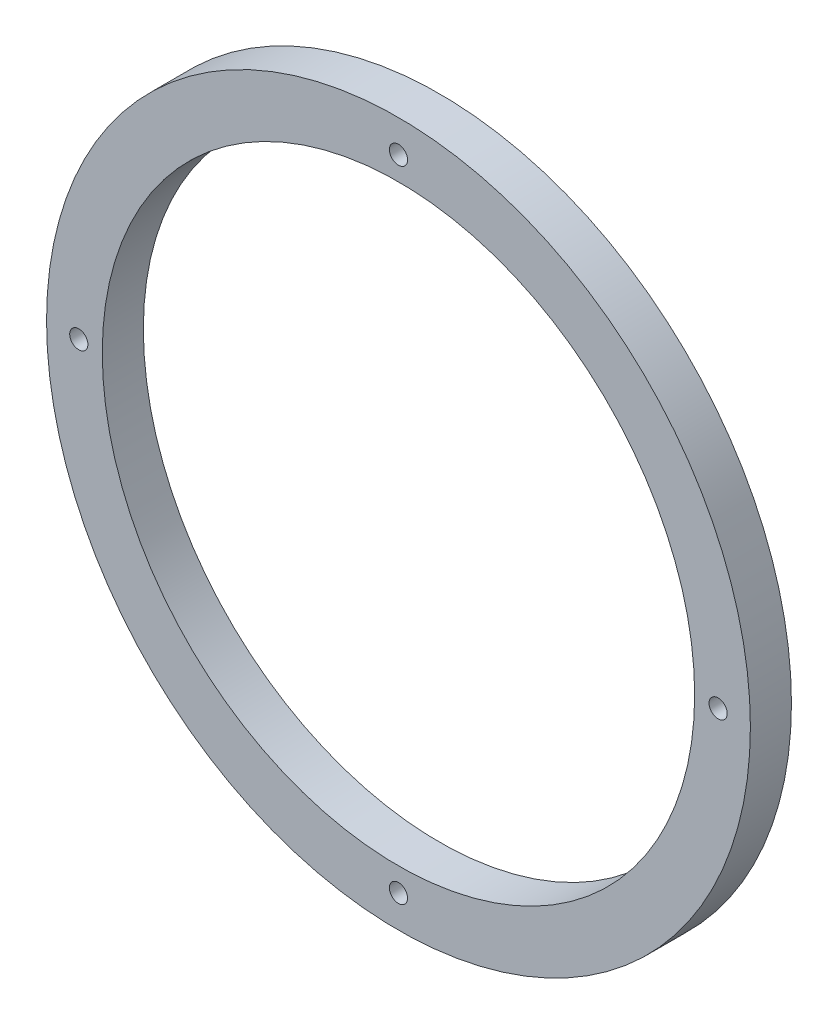
ISO-10303-21;
HEADER;
FILE_DESCRIPTION(('STEP AP214'),'2;1');
FILE_NAME('part.step','',(''),(''),'','','');
FILE_SCHEMA(('AUTOMOTIVE_DESIGN { 1 0 10303 214 1 1 1 1 }'));
ENDSEC;
DATA;
#1=APPLICATION_CONTEXT('core data for automotive mechanical design processes');
#2=APPLICATION_PROTOCOL_DEFINITION('international standard','automotive_design',2000,#1);
#3=PRODUCT_CONTEXT('',#1,'mechanical');
#4=PRODUCT('Part','Part','',(#3));
#5=PRODUCT_RELATED_PRODUCT_CATEGORY('part','',(#4));
#6=PRODUCT_DEFINITION_FORMATION('','',#4);
#7=PRODUCT_DEFINITION_CONTEXT('part definition',#1,'design');
#8=PRODUCT_DEFINITION('design','',#6,#7);
#9=PRODUCT_DEFINITION_SHAPE('','',#8);
#10=(LENGTH_UNIT() NAMED_UNIT(*) SI_UNIT(.MILLI.,.METRE.));
#11=(NAMED_UNIT(*) PLANE_ANGLE_UNIT() SI_UNIT($,.RADIAN.));
#12=(NAMED_UNIT(*) SI_UNIT($,.STERADIAN.) SOLID_ANGLE_UNIT());
#13=UNCERTAINTY_MEASURE_WITH_UNIT(LENGTH_MEASURE(1.E-05),#10,'distance_accuracy_value','');
#14=(GEOMETRIC_REPRESENTATION_CONTEXT(3) GLOBAL_UNCERTAINTY_ASSIGNED_CONTEXT((#13)) GLOBAL_UNIT_ASSIGNED_CONTEXT((#10,
#11,#12)) REPRESENTATION_CONTEXT('',''));
#15=CARTESIAN_POINT('',(0.,0.,0.));
#16=DIRECTION('',(0.,0.,1.));
#17=DIRECTION('',(1.,0.,0.));
#18=AXIS2_PLACEMENT_3D('',#15,#16,#17);
#19=CARTESIAN_POINT('',(0.,0.,7.));
#20=DIRECTION('',(0.,0.,1.));
#21=DIRECTION('',(1.,0.,0.));
#22=AXIS2_PLACEMENT_3D('',#19,#20,#21);
#23=PLANE('',#22);
#24=CARTESIAN_POINT('',(-5.70857198900852E-13,-54.5,7.));
#25=DIRECTION('',(0.,0.,1.));
#26=DIRECTION('',(1.,0.,0.));
#27=AXIS2_PLACEMENT_3D('',#24,#25,#26);
#28=CIRCLE('',#27,1.55);
#29=CARTESIAN_POINT('',(1.54999999999943,-54.5,7.));
#30=VERTEX_POINT('',#29);
#31=EDGE_CURVE('E70',#30,#30,#28,.T.);
#32=ORIENTED_EDGE('',*,*,#31,.F.);
#33=EDGE_LOOP('',(#32));
#34=FACE_BOUND('',#33,.T.);
#35=CARTESIAN_POINT('',(54.5,-3.80571465933902E-13,7.));
#36=DIRECTION('',(0.,0.,1.));
#37=DIRECTION('',(1.,0.,0.));
#38=AXIS2_PLACEMENT_3D('',#35,#36,#37);
#39=CIRCLE('',#38,1.55);
#40=CARTESIAN_POINT('',(56.05,-3.80571465933902E-13,7.));
#41=VERTEX_POINT('',#40);
#42=EDGE_CURVE('E64',#41,#41,#39,.T.);
#43=ORIENTED_EDGE('',*,*,#42,.F.);
#44=EDGE_LOOP('',(#43));
#45=FACE_BOUND('',#44,.T.);
#46=CARTESIAN_POINT('',(1.90285732966951E-13,54.5,7.));
#47=DIRECTION('',(0.,0.,1.));
#48=DIRECTION('',(1.,0.,0.));
#49=AXIS2_PLACEMENT_3D('',#46,#47,#48);
#50=CIRCLE('',#49,1.55);
#51=CARTESIAN_POINT('',(1.55000000000019,54.5,7.));
#52=VERTEX_POINT('',#51);
#53=EDGE_CURVE('E58',#52,#52,#50,.T.);
#54=ORIENTED_EDGE('',*,*,#53,.F.);
#55=EDGE_LOOP('',(#54));
#56=FACE_BOUND('',#55,.T.);
#57=CARTESIAN_POINT('',(-54.5,0.,7.));
#58=DIRECTION('',(0.,0.,1.));
#59=DIRECTION('',(1.,0.,0.));
#60=AXIS2_PLACEMENT_3D('',#57,#58,#59);
#61=CIRCLE('',#60,1.55);
#62=CARTESIAN_POINT('',(-52.95,0.,7.));
#63=VERTEX_POINT('',#62);
#64=EDGE_CURVE('E52',#63,#63,#61,.T.);
#65=ORIENTED_EDGE('',*,*,#64,.F.);
#66=EDGE_LOOP('',(#65));
#67=FACE_BOUND('',#66,.T.);
#68=CARTESIAN_POINT('',(0.,0.,7.));
#69=DIRECTION('',(0.,0.,1.));
#70=DIRECTION('',(1.,0.,0.));
#71=AXIS2_PLACEMENT_3D('',#68,#69,#70);
#72=CIRCLE('',#71,60.);
#73=CARTESIAN_POINT('',(60.,0.,7.));
#74=VERTEX_POINT('',#73);
#75=EDGE_CURVE('E10',#74,#74,#72,.T.);
#76=ORIENTED_EDGE('',*,*,#75,.T.);
#77=EDGE_LOOP('',(#76));
#78=FACE_BOUND('',#77,.T.);
#79=CARTESIAN_POINT('',(0.,0.,7.));
#80=DIRECTION('',(0.,0.,1.));
#81=DIRECTION('',(1.,0.,0.));
#82=AXIS2_PLACEMENT_3D('',#79,#80,#81);
#83=CIRCLE('',#82,50.5);
#84=CARTESIAN_POINT('',(50.5,0.,7.));
#85=VERTEX_POINT('',#84);
#86=EDGE_CURVE('E44',#85,#85,#83,.T.);
#87=ORIENTED_EDGE('',*,*,#86,.F.);
#88=EDGE_LOOP('',(#87));
#89=FACE_BOUND('',#88,.T.);
#90=ADVANCED_FACE('F33',(#34,#45,#56,#67,#78,#89),#23,.T.);
#91=CARTESIAN_POINT('',(0.,0.,0.));
#92=DIRECTION('',(0.,0.,1.));
#93=DIRECTION('',(1.,0.,0.));
#94=AXIS2_PLACEMENT_3D('',#91,#92,#93);
#95=PLANE('',#94);
#96=CARTESIAN_POINT('',(-5.70857198900852E-13,-54.5,0.));
#97=DIRECTION('',(0.,0.,1.));
#98=DIRECTION('',(1.,0.,0.));
#99=AXIS2_PLACEMENT_3D('',#96,#97,#98);
#100=CIRCLE('',#99,1.55);
#101=CARTESIAN_POINT('',(1.54999999999943,-54.5,0.));
#102=VERTEX_POINT('',#101);
#103=EDGE_CURVE('E67',#102,#102,#100,.T.);
#104=ORIENTED_EDGE('',*,*,#103,.T.);
#105=EDGE_LOOP('',(#104));
#106=FACE_BOUND('',#105,.T.);
#107=CARTESIAN_POINT('',(54.5,-3.80571465933902E-13,0.));
#108=DIRECTION('',(0.,0.,1.));
#109=DIRECTION('',(1.,0.,0.));
#110=AXIS2_PLACEMENT_3D('',#107,#108,#109);
#111=CIRCLE('',#110,1.55);
#112=CARTESIAN_POINT('',(56.05,-3.80571465933902E-13,0.));
#113=VERTEX_POINT('',#112);
#114=EDGE_CURVE('E61',#113,#113,#111,.T.);
#115=ORIENTED_EDGE('',*,*,#114,.T.);
#116=EDGE_LOOP('',(#115));
#117=FACE_BOUND('',#116,.T.);
#118=CARTESIAN_POINT('',(1.90285732966951E-13,54.5,0.));
#119=DIRECTION('',(0.,0.,1.));
#120=DIRECTION('',(1.,0.,0.));
#121=AXIS2_PLACEMENT_3D('',#118,#119,#120);
#122=CIRCLE('',#121,1.55);
#123=CARTESIAN_POINT('',(1.55000000000019,54.5,0.));
#124=VERTEX_POINT('',#123);
#125=EDGE_CURVE('E55',#124,#124,#122,.T.);
#126=ORIENTED_EDGE('',*,*,#125,.T.);
#127=EDGE_LOOP('',(#126));
#128=FACE_BOUND('',#127,.T.);
#129=CARTESIAN_POINT('',(-54.5,0.,0.));
#130=DIRECTION('',(0.,0.,1.));
#131=DIRECTION('',(1.,0.,0.));
#132=AXIS2_PLACEMENT_3D('',#129,#130,#131);
#133=CIRCLE('',#132,1.55);
#134=CARTESIAN_POINT('',(-52.95,0.,0.));
#135=VERTEX_POINT('',#134);
#136=EDGE_CURVE('E49',#135,#135,#133,.T.);
#137=ORIENTED_EDGE('',*,*,#136,.T.);
#138=EDGE_LOOP('',(#137));
#139=FACE_BOUND('',#138,.T.);
#140=CARTESIAN_POINT('',(0.,0.,0.));
#141=DIRECTION('',(0.,0.,1.));
#142=DIRECTION('',(1.,0.,0.));
#143=AXIS2_PLACEMENT_3D('',#140,#141,#142);
#144=CIRCLE('',#143,60.);
#145=CARTESIAN_POINT('',(60.,0.,0.));
#146=VERTEX_POINT('',#145);
#147=EDGE_CURVE('E37',#146,#146,#144,.T.);
#148=ORIENTED_EDGE('',*,*,#147,.F.);
#149=EDGE_LOOP('',(#148));
#150=FACE_BOUND('',#149,.T.);
#151=CARTESIAN_POINT('',(0.,0.,0.));
#152=DIRECTION('',(0.,0.,1.));
#153=DIRECTION('',(1.,0.,0.));
#154=AXIS2_PLACEMENT_3D('',#151,#152,#153);
#155=CIRCLE('',#154,50.5);
#156=CARTESIAN_POINT('',(50.5,0.,0.));
#157=VERTEX_POINT('',#156);
#158=EDGE_CURVE('E46',#157,#157,#155,.T.);
#159=ORIENTED_EDGE('',*,*,#158,.T.);
#160=EDGE_LOOP('',(#159));
#161=FACE_BOUND('',#160,.T.);
#162=ADVANCED_FACE('F76',(#106,#117,#128,#139,#150,#161),#95,.F.);
#163=CARTESIAN_POINT('',(0.,0.,7.));
#164=DIRECTION('',(0.,0.,-1.));
#165=DIRECTION('',(-1.,0.,0.));
#166=AXIS2_PLACEMENT_3D('',#163,#164,#165);
#167=CYLINDRICAL_SURFACE('',#166,60.);
#168=ORIENTED_EDGE('',*,*,#75,.F.);
#169=EDGE_LOOP('',(#168));
#170=FACE_BOUND('',#169,.T.);
#171=ORIENTED_EDGE('',*,*,#147,.T.);
#172=EDGE_LOOP('',(#171));
#173=FACE_BOUND('',#172,.T.);
#174=ADVANCED_FACE('F35',(#170,#173),#167,.T.);
#175=CARTESIAN_POINT('',(0.,0.,7.));
#176=DIRECTION('',(0.,0.,-1.));
#177=DIRECTION('',(-1.,0.,0.));
#178=AXIS2_PLACEMENT_3D('',#175,#176,#177);
#179=CYLINDRICAL_SURFACE('',#178,50.5);
#180=ORIENTED_EDGE('',*,*,#86,.T.);
#181=EDGE_LOOP('',(#180));
#182=FACE_BOUND('',#181,.T.);
#183=ORIENTED_EDGE('',*,*,#158,.F.);
#184=EDGE_LOOP('',(#183));
#185=FACE_BOUND('',#184,.T.);
#186=ADVANCED_FACE('F97',(#182,#185),#179,.F.);
#187=CARTESIAN_POINT('',(-54.5,0.,0.));
#188=DIRECTION('',(0.,0.,1.));
#189=DIRECTION('',(1.,0.,0.));
#190=AXIS2_PLACEMENT_3D('',#187,#188,#189);
#191=CYLINDRICAL_SURFACE('',#190,1.55);
#192=ORIENTED_EDGE('',*,*,#136,.F.);
#193=EDGE_LOOP('',(#192));
#194=FACE_BOUND('',#193,.T.);
#195=ORIENTED_EDGE('',*,*,#64,.T.);
#196=EDGE_LOOP('',(#195));
#197=FACE_BOUND('',#196,.T.);
#198=ADVANCED_FACE('F100',(#194,#197),#191,.F.);
#199=CARTESIAN_POINT('',(1.90285732966951E-13,54.5,0.));
#200=DIRECTION('',(0.,0.,1.));
#201=DIRECTION('',(1.,0.,0.));
#202=AXIS2_PLACEMENT_3D('',#199,#200,#201);
#203=CYLINDRICAL_SURFACE('',#202,1.55);
#204=ORIENTED_EDGE('',*,*,#125,.F.);
#205=EDGE_LOOP('',(#204));
#206=FACE_BOUND('',#205,.T.);
#207=ORIENTED_EDGE('',*,*,#53,.T.);
#208=EDGE_LOOP('',(#207));
#209=FACE_BOUND('',#208,.T.);
#210=ADVANCED_FACE('F112',(#206,#209),#203,.F.);
#211=CARTESIAN_POINT('',(54.5,-3.80571465933902E-13,0.));
#212=DIRECTION('',(0.,0.,1.));
#213=DIRECTION('',(1.,0.,0.));
#214=AXIS2_PLACEMENT_3D('',#211,#212,#213);
#215=CYLINDRICAL_SURFACE('',#214,1.55);
#216=ORIENTED_EDGE('',*,*,#114,.F.);
#217=EDGE_LOOP('',(#216));
#218=FACE_BOUND('',#217,.T.);
#219=ORIENTED_EDGE('',*,*,#42,.T.);
#220=EDGE_LOOP('',(#219));
#221=FACE_BOUND('',#220,.T.);
#222=ADVANCED_FACE('F82',(#218,#221),#215,.F.);
#223=CARTESIAN_POINT('',(-5.70857198900852E-13,-54.5,0.));
#224=DIRECTION('',(0.,0.,1.));
#225=DIRECTION('',(1.,0.,0.));
#226=AXIS2_PLACEMENT_3D('',#223,#224,#225);
#227=CYLINDRICAL_SURFACE('',#226,1.55);
#228=ORIENTED_EDGE('',*,*,#103,.F.);
#229=EDGE_LOOP('',(#228));
#230=FACE_BOUND('',#229,.T.);
#231=ORIENTED_EDGE('',*,*,#31,.T.);
#232=EDGE_LOOP('',(#231));
#233=FACE_BOUND('',#232,.T.);
#234=ADVANCED_FACE('F79',(#230,#233),#227,.F.);
#235=CLOSED_SHELL('',(#90,#162,#174,#186,#198,#210,#222,#234));
#236=MANIFOLD_SOLID_BREP('B2',#235);
#237=ADVANCED_BREP_SHAPE_REPRESENTATION('',(#18,#236),#14);
#238=SHAPE_DEFINITION_REPRESENTATION(#9,#237);
ENDSEC;
END-ISO-10303-21;
